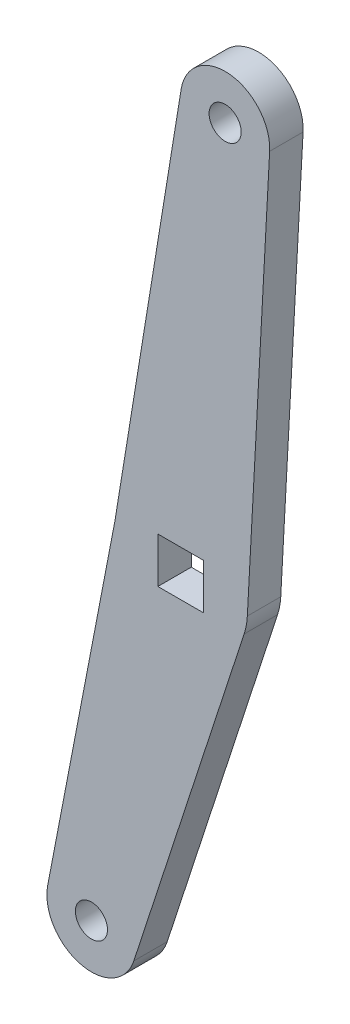
ISO-10303-21;
HEADER;
FILE_DESCRIPTION(('STEP AP214'),'2;1');
FILE_NAME('part.step','',(''),(''),'','','');
FILE_SCHEMA(('AUTOMOTIVE_DESIGN { 1 0 10303 214 1 1 1 1 }'));
ENDSEC;
DATA;
#1=APPLICATION_CONTEXT('core data for automotive mechanical design processes');
#2=APPLICATION_PROTOCOL_DEFINITION('international standard','automotive_design',2000,#1);
#3=PRODUCT_CONTEXT('',#1,'mechanical');
#4=PRODUCT('Part','Part','',(#3));
#5=PRODUCT_RELATED_PRODUCT_CATEGORY('part','',(#4));
#6=PRODUCT_DEFINITION_FORMATION('','',#4);
#7=PRODUCT_DEFINITION_CONTEXT('part definition',#1,'design');
#8=PRODUCT_DEFINITION('design','',#6,#7);
#9=PRODUCT_DEFINITION_SHAPE('','',#8);
#10=(LENGTH_UNIT() NAMED_UNIT(*) SI_UNIT(.MILLI.,.METRE.));
#11=(NAMED_UNIT(*) PLANE_ANGLE_UNIT() SI_UNIT($,.RADIAN.));
#12=(NAMED_UNIT(*) SI_UNIT($,.STERADIAN.) SOLID_ANGLE_UNIT());
#13=UNCERTAINTY_MEASURE_WITH_UNIT(LENGTH_MEASURE(1.E-05),#10,'distance_accuracy_value','');
#14=(GEOMETRIC_REPRESENTATION_CONTEXT(3) GLOBAL_UNCERTAINTY_ASSIGNED_CONTEXT((#13)) GLOBAL_UNIT_ASSIGNED_CONTEXT((#10,
#11,#12)) REPRESENTATION_CONTEXT('',''));
#15=CARTESIAN_POINT('',(0.,0.,0.));
#16=DIRECTION('',(0.,0.,1.));
#17=DIRECTION('',(1.,0.,0.));
#18=AXIS2_PLACEMENT_3D('',#15,#16,#17);
#19=CARTESIAN_POINT('',(0.,0.,4.7625));
#20=DIRECTION('',(0.,0.,1.));
#21=DIRECTION('',(1.,0.,0.));
#22=AXIS2_PLACEMENT_3D('',#19,#20,#21);
#23=PLANE('',#22);
#24=CARTESIAN_POINT('',(0.,0.,4.7625));
#25=DIRECTION('',(0.,0.,1.));
#26=DIRECTION('',(1.,0.,0.));
#27=AXIS2_PLACEMENT_3D('',#24,#25,#26);
#28=CIRCLE('',#27,2.286);
#29=CARTESIAN_POINT('',(-2.286,0.,4.7625));
#30=VERTEX_POINT('',#29);
#31=EDGE_CURVE('E208',#30,#30,#28,.T.);
#32=ORIENTED_EDGE('',*,*,#31,.F.);
#33=EDGE_LOOP('',(#32));
#34=FACE_BOUND('',#33,.T.);
#35=CARTESIAN_POINT('',(0.,0.,4.7625));
#36=DIRECTION('',(0.,0.,1.));
#37=DIRECTION('',(1.,0.,0.));
#38=AXIS2_PLACEMENT_3D('',#35,#36,#37);
#39=CIRCLE('',#38,6.35);
#40=CARTESIAN_POINT('',(-6.23554390119722,1.2002050892419,4.7625));
#41=VERTEX_POINT('',#40);
#42=CARTESIAN_POINT('',(6.03712204437629,-1.96866894659967,4.7625));
#43=VERTEX_POINT('',#42);
#44=EDGE_CURVE('E216',#41,#43,#39,.T.);
#45=ORIENTED_EDGE('',*,*,#44,.T.);
#46=DIRECTION('',(0.310026605763728,0.95072788100414,0.));
#47=VECTOR('',#46,1.);
#48=CARTESIAN_POINT('',(6.03712204437629,-1.96866894659967,4.7625));
#49=LINE('',#48,#47);
#50=CARTESIAN_POINT('',(21.7556830665642,46.2338850769344,4.7625));
#51=VERTEX_POINT('',#50);
#52=EDGE_CURVE('E220',#43,#51,#49,.T.);
#53=ORIENTED_EDGE('',*,*,#52,.T.);
#54=CARTESIAN_POINT('',(12.6999999999998,49.1868884968339,4.7625));
#55=DIRECTION('',(0.,0.,1.));
#56=DIRECTION('',(1.,0.,0.));
#57=AXIS2_PLACEMENT_3D('',#54,#55,#56);
#58=CIRCLE('',#57,9.525);
#59=CARTESIAN_POINT('',(22.2111674616562,48.6737427901112,4.7625));
#60=VERTEX_POINT('',#59);
#61=EDGE_CURVE('E224',#51,#60,#58,.T.);
#62=ORIENTED_EDGE('',*,*,#61,.T.);
#63=DIRECTION('',(0.0538735650102594,0.9985477650033,0.));
#64=VECTOR('',#63,1.);
#65=CARTESIAN_POINT('',(22.2111674616562,48.6737427901112,4.7625));
#66=LINE('',#65,#64);
#67=CARTESIAN_POINT('',(25.3907783077707,107.607902862185,4.7625));
#68=VERTEX_POINT('',#67);
#69=EDGE_CURVE('E227',#60,#68,#66,.T.);
#70=ORIENTED_EDGE('',*,*,#69,.T.);
#71=CARTESIAN_POINT('',(19.0499999999997,107.95,4.7625));
#72=DIRECTION('',(0.,0.,1.));
#73=DIRECTION('',(1.,0.,0.));
#74=AXIS2_PLACEMENT_3D('',#71,#72,#73);
#75=CIRCLE('',#74,6.35);
#76=CARTESIAN_POINT('',(12.782434592062,108.96986462691,4.7625));
#77=VERTEX_POINT('',#76);
#78=EDGE_CURVE('E230',#68,#77,#75,.T.);
#79=ORIENTED_EDGE('',*,*,#78,.T.);
#80=DIRECTION('',(-0.160608602663017,-0.98701817447838,0.));
#81=VECTOR('',#80,1.);
#82=CARTESIAN_POINT('',(3.36257567438122,51.0802385507713,4.7625));
#83=LINE('',#82,#81);
#84=CARTESIAN_POINT('',(3.36257567438122,51.0802385507713,4.7625));
#85=VERTEX_POINT('',#84);
#86=EDGE_CURVE('E233',#77,#85,#83,.T.);
#87=ORIENTED_EDGE('',*,*,#86,.T.);
#88=CARTESIAN_POINT('',(-2.90498973355649,52.1001031776814,4.7625));
#89=DIRECTION('',(0.,0.,-1.));
#90=DIRECTION('',(1.,0.,0.));
#91=AXIS2_PLACEMENT_3D('',#88,#89,#90);
#92=CIRCLE('',#91,6.35);
#93=CARTESIAN_POINT('',(3.33055416764073,50.8998980884395,4.7625));
#94=VERTEX_POINT('',#93);
#95=EDGE_CURVE('E236',#85,#94,#92,.T.);
#96=ORIENTED_EDGE('',*,*,#95,.T.);
#97=DIRECTION('',(-0.189008675471165,-0.981975417511373,0.));
#98=VECTOR('',#97,1.);
#99=CARTESIAN_POINT('',(-6.23554390119722,1.2002050892419,4.7625));
#100=LINE('',#99,#98);
#101=EDGE_CURVE('E239',#94,#41,#100,.T.);
#102=ORIENTED_EDGE('',*,*,#101,.T.);
#103=EDGE_LOOP('',(#45,#53,#62,#70,#79,#87,#96,#102));
#104=FACE_BOUND('',#103,.T.);
#105=CARTESIAN_POINT('',(19.0499999999997,107.95,4.7625));
#106=DIRECTION('',(0.,0.,1.));
#107=DIRECTION('',(1.,0.,0.));
#108=AXIS2_PLACEMENT_3D('',#105,#106,#107);
#109=CIRCLE('',#108,2.286);
#110=CARTESIAN_POINT('',(16.7639999999997,107.95,4.7625));
#111=VERTEX_POINT('',#110);
#112=EDGE_CURVE('E202',#111,#111,#109,.T.);
#113=ORIENTED_EDGE('',*,*,#112,.F.);
#114=EDGE_LOOP('',(#113));
#115=FACE_BOUND('',#114,.T.);
#116=DIRECTION('',(-1.,0.,0.));
#117=VECTOR('',#116,1.);
#118=CARTESIAN_POINT('',(9.46149999999975,52.4253884968339,4.7625));
#119=LINE('',#118,#117);
#120=CARTESIAN_POINT('',(15.9384999999998,52.4253884968339,4.7625));
#121=VERTEX_POINT('',#120);
#122=CARTESIAN_POINT('',(9.46149999999975,52.4253884968339,4.7625));
#123=VERTEX_POINT('',#122);
#124=EDGE_CURVE('E163',#121,#123,#119,.T.);
#125=ORIENTED_EDGE('',*,*,#124,.F.);
#126=DIRECTION('',(0.,1.,0.));
#127=VECTOR('',#126,1.);
#128=CARTESIAN_POINT('',(15.9384999999998,45.9483884968339,4.7625));
#129=LINE('',#128,#127);
#130=CARTESIAN_POINT('',(15.9384999999998,45.9483884968339,4.7625));
#131=VERTEX_POINT('',#130);
#132=EDGE_CURVE('E154',#131,#121,#129,.T.);
#133=ORIENTED_EDGE('',*,*,#132,.F.);
#134=DIRECTION('',(1.,0.,0.));
#135=VECTOR('',#134,1.);
#136=CARTESIAN_POINT('',(9.46149999999975,45.9483884968339,4.7625));
#137=LINE('',#136,#135);
#138=CARTESIAN_POINT('',(9.46149999999975,45.9483884968339,4.7625));
#139=VERTEX_POINT('',#138);
#140=EDGE_CURVE('E180',#139,#131,#137,.T.);
#141=ORIENTED_EDGE('',*,*,#140,.F.);
#142=DIRECTION('',(0.,-1.,0.));
#143=VECTOR('',#142,1.);
#144=CARTESIAN_POINT('',(9.46149999999975,45.9483884968339,4.7625));
#145=LINE('',#144,#143);
#146=EDGE_CURVE('E176',#123,#139,#145,.T.);
#147=ORIENTED_EDGE('',*,*,#146,.F.);
#148=EDGE_LOOP('',(#125,#133,#141,#147));
#149=FACE_BOUND('',#148,.T.);
#150=ADVANCED_FACE('F45',(#34,#104,#115,#149),#23,.T.);
#151=CARTESIAN_POINT('',(0.,0.,0.));
#152=DIRECTION('',(0.,0.,1.));
#153=DIRECTION('',(1.,0.,0.));
#154=AXIS2_PLACEMENT_3D('',#151,#152,#153);
#155=PLANE('',#154);
#156=CARTESIAN_POINT('',(19.0499999999997,107.95,0.));
#157=DIRECTION('',(0.,0.,1.));
#158=DIRECTION('',(1.,0.,0.));
#159=AXIS2_PLACEMENT_3D('',#156,#157,#158);
#160=CIRCLE('',#159,2.286);
#161=CARTESIAN_POINT('',(16.7639999999997,107.95,0.));
#162=VERTEX_POINT('',#161);
#163=EDGE_CURVE('E172',#162,#162,#160,.T.);
#164=ORIENTED_EDGE('',*,*,#163,.T.);
#165=EDGE_LOOP('',(#164));
#166=FACE_BOUND('',#165,.T.);
#167=CARTESIAN_POINT('',(0.,0.,0.));
#168=DIRECTION('',(0.,0.,1.));
#169=DIRECTION('',(1.,0.,0.));
#170=AXIS2_PLACEMENT_3D('',#167,#168,#169);
#171=CIRCLE('',#170,2.286);
#172=CARTESIAN_POINT('',(-2.286,0.,0.));
#173=VERTEX_POINT('',#172);
#174=EDGE_CURVE('E205',#173,#173,#171,.T.);
#175=ORIENTED_EDGE('',*,*,#174,.T.);
#176=EDGE_LOOP('',(#175));
#177=FACE_BOUND('',#176,.T.);
#178=CARTESIAN_POINT('',(0.,0.,0.));
#179=DIRECTION('',(0.,0.,1.));
#180=DIRECTION('',(1.,0.,0.));
#181=AXIS2_PLACEMENT_3D('',#178,#179,#180);
#182=CIRCLE('',#181,6.35);
#183=CARTESIAN_POINT('',(-6.23554390119722,1.2002050892419,0.));
#184=VERTEX_POINT('',#183);
#185=CARTESIAN_POINT('',(6.03712204437629,-1.96866894659967,0.));
#186=VERTEX_POINT('',#185);
#187=EDGE_CURVE('E212',#184,#186,#182,.T.);
#188=ORIENTED_EDGE('',*,*,#187,.F.);
#189=DIRECTION('',(-0.189008675471165,-0.981975417511373,0.));
#190=VECTOR('',#189,1.);
#191=CARTESIAN_POINT('',(-6.23554390119722,1.2002050892419,0.));
#192=LINE('',#191,#190);
#193=CARTESIAN_POINT('',(3.33055416764073,50.8998980884395,0.));
#194=VERTEX_POINT('',#193);
#195=EDGE_CURVE('E221',#194,#184,#192,.T.);
#196=ORIENTED_EDGE('',*,*,#195,.F.);
#197=CARTESIAN_POINT('',(-2.90498973355649,52.1001031776814,0.));
#198=DIRECTION('',(0.,0.,-1.));
#199=DIRECTION('',(1.,0.,0.));
#200=AXIS2_PLACEMENT_3D('',#197,#198,#199);
#201=CIRCLE('',#200,6.35);
#202=CARTESIAN_POINT('',(3.36257567438122,51.0802385507713,0.));
#203=VERTEX_POINT('',#202);
#204=EDGE_CURVE('E261',#203,#194,#201,.T.);
#205=ORIENTED_EDGE('',*,*,#204,.F.);
#206=DIRECTION('',(-0.160608602663017,-0.98701817447838,0.));
#207=VECTOR('',#206,1.);
#208=CARTESIAN_POINT('',(3.36257567438122,51.0802385507713,0.));
#209=LINE('',#208,#207);
#210=CARTESIAN_POINT('',(12.782434592062,108.96986462691,0.));
#211=VERTEX_POINT('',#210);
#212=EDGE_CURVE('E258',#211,#203,#209,.T.);
#213=ORIENTED_EDGE('',*,*,#212,.F.);
#214=CARTESIAN_POINT('',(19.0499999999997,107.95,0.));
#215=DIRECTION('',(0.,0.,1.));
#216=DIRECTION('',(1.,0.,0.));
#217=AXIS2_PLACEMENT_3D('',#214,#215,#216);
#218=CIRCLE('',#217,6.35);
#219=CARTESIAN_POINT('',(25.3907783077707,107.607902862185,0.));
#220=VERTEX_POINT('',#219);
#221=EDGE_CURVE('E255',#220,#211,#218,.T.);
#222=ORIENTED_EDGE('',*,*,#221,.F.);
#223=DIRECTION('',(0.0538735650102594,0.9985477650033,0.));
#224=VECTOR('',#223,1.);
#225=CARTESIAN_POINT('',(22.2111674616562,48.6737427901112,0.));
#226=LINE('',#225,#224);
#227=CARTESIAN_POINT('',(22.2111674616562,48.6737427901112,0.));
#228=VERTEX_POINT('',#227);
#229=EDGE_CURVE('E252',#228,#220,#226,.T.);
#230=ORIENTED_EDGE('',*,*,#229,.F.);
#231=CARTESIAN_POINT('',(12.6999999999998,49.1868884968339,0.));
#232=DIRECTION('',(0.,0.,1.));
#233=DIRECTION('',(1.,0.,0.));
#234=AXIS2_PLACEMENT_3D('',#231,#232,#233);
#235=CIRCLE('',#234,9.525);
#236=CARTESIAN_POINT('',(21.7556830665642,46.2338850769344,0.));
#237=VERTEX_POINT('',#236);
#238=EDGE_CURVE('E249',#237,#228,#235,.T.);
#239=ORIENTED_EDGE('',*,*,#238,.F.);
#240=DIRECTION('',(0.310026605763728,0.95072788100414,0.));
#241=VECTOR('',#240,1.);
#242=CARTESIAN_POINT('',(6.03712204437629,-1.96866894659967,0.));
#243=LINE('',#242,#241);
#244=EDGE_CURVE('E246',#186,#237,#243,.T.);
#245=ORIENTED_EDGE('',*,*,#244,.F.);
#246=EDGE_LOOP('',(#188,#196,#205,#213,#222,#230,#239,#245));
#247=FACE_BOUND('',#246,.T.);
#248=DIRECTION('',(0.,1.,0.));
#249=VECTOR('',#248,1.);
#250=CARTESIAN_POINT('',(15.9384999999998,45.9483884968339,0.));
#251=LINE('',#250,#249);
#252=CARTESIAN_POINT('',(15.9384999999998,45.9483884968339,0.));
#253=VERTEX_POINT('',#252);
#254=CARTESIAN_POINT('',(15.9384999999998,52.4253884968339,0.));
#255=VERTEX_POINT('',#254);
#256=EDGE_CURVE('E74',#253,#255,#251,.T.);
#257=ORIENTED_EDGE('',*,*,#256,.T.);
#258=DIRECTION('',(-1.,0.,0.));
#259=VECTOR('',#258,1.);
#260=CARTESIAN_POINT('',(9.46149999999975,52.4253884968339,0.));
#261=LINE('',#260,#259);
#262=CARTESIAN_POINT('',(9.46149999999975,52.4253884968339,0.));
#263=VERTEX_POINT('',#262);
#264=EDGE_CURVE('E170',#255,#263,#261,.T.);
#265=ORIENTED_EDGE('',*,*,#264,.T.);
#266=DIRECTION('',(0.,-1.,0.));
#267=VECTOR('',#266,1.);
#268=CARTESIAN_POINT('',(9.46149999999975,45.9483884968339,0.));
#269=LINE('',#268,#267);
#270=CARTESIAN_POINT('',(9.46149999999975,45.9483884968339,0.));
#271=VERTEX_POINT('',#270);
#272=EDGE_CURVE('E189',#263,#271,#269,.T.);
#273=ORIENTED_EDGE('',*,*,#272,.T.);
#274=DIRECTION('',(1.,0.,0.));
#275=VECTOR('',#274,1.);
#276=CARTESIAN_POINT('',(9.46149999999975,45.9483884968339,0.));
#277=LINE('',#276,#275);
#278=EDGE_CURVE('E164',#271,#253,#277,.T.);
#279=ORIENTED_EDGE('',*,*,#278,.T.);
#280=EDGE_LOOP('',(#257,#265,#273,#279));
#281=FACE_BOUND('',#280,.T.);
#282=ADVANCED_FACE('F299',(#166,#177,#247,#281),#155,.F.);
#283=CARTESIAN_POINT('',(0.,0.,4.7625));
#284=DIRECTION('',(0.,0.,-1.));
#285=DIRECTION('',(-1.,0.,0.));
#286=AXIS2_PLACEMENT_3D('',#283,#284,#285);
#287=CYLINDRICAL_SURFACE('',#286,6.35);
#288=ORIENTED_EDGE('',*,*,#187,.T.);
#289=DIRECTION('',(0.,0.,-1.));
#290=VECTOR('',#289,1.);
#291=CARTESIAN_POINT('',(6.03712204437629,-1.96866894659967,4.7625));
#292=LINE('',#291,#290);
#293=EDGE_CURVE('E11',#43,#186,#292,.T.);
#294=ORIENTED_EDGE('',*,*,#293,.F.);
#295=ORIENTED_EDGE('',*,*,#44,.F.);
#296=DIRECTION('',(0.,0.,-1.));
#297=VECTOR('',#296,1.);
#298=CARTESIAN_POINT('',(-6.23554390119722,1.2002050892419,4.7625));
#299=LINE('',#298,#297);
#300=EDGE_CURVE('E242',#41,#184,#299,.T.);
#301=ORIENTED_EDGE('',*,*,#300,.T.);
#302=EDGE_LOOP('',(#288,#294,#295,#301));
#303=FACE_BOUND('',#302,.T.);
#304=ADVANCED_FACE('F47',(#303),#287,.T.);
#305=CARTESIAN_POINT('',(6.03712204437629,-1.96866894659967,4.7625));
#306=DIRECTION('',(-0.95072788100414,0.310026605763728,0.));
#307=DIRECTION('',(-0.310026605763728,-0.95072788100414,0.));
#308=AXIS2_PLACEMENT_3D('',#305,#306,#307);
#309=PLANE('',#308);
#310=ORIENTED_EDGE('',*,*,#244,.T.);
#311=DIRECTION('',(0.,0.,-1.));
#312=VECTOR('',#311,1.);
#313=CARTESIAN_POINT('',(21.7556830665642,46.2338850769344,4.7625));
#314=LINE('',#313,#312);
#315=EDGE_CURVE('E53',#51,#237,#314,.T.);
#316=ORIENTED_EDGE('',*,*,#315,.F.);
#317=ORIENTED_EDGE('',*,*,#52,.F.);
#318=ORIENTED_EDGE('',*,*,#293,.T.);
#319=EDGE_LOOP('',(#310,#316,#317,#318));
#320=FACE_BOUND('',#319,.T.);
#321=ADVANCED_FACE('F317',(#320),#309,.F.);
#322=CARTESIAN_POINT('',(12.6999999999998,49.1868884968339,4.7625));
#323=DIRECTION('',(0.,0.,-1.));
#324=DIRECTION('',(-1.,0.,0.));
#325=AXIS2_PLACEMENT_3D('',#322,#323,#324);
#326=CYLINDRICAL_SURFACE('',#325,9.525);
#327=ORIENTED_EDGE('',*,*,#238,.T.);
#328=DIRECTION('',(0.,0.,-1.));
#329=VECTOR('',#328,1.);
#330=CARTESIAN_POINT('',(22.2111674616562,48.6737427901112,4.7625));
#331=LINE('',#330,#329);
#332=EDGE_CURVE('E284',#60,#228,#331,.T.);
#333=ORIENTED_EDGE('',*,*,#332,.F.);
#334=ORIENTED_EDGE('',*,*,#61,.F.);
#335=ORIENTED_EDGE('',*,*,#315,.T.);
#336=EDGE_LOOP('',(#327,#333,#334,#335));
#337=FACE_BOUND('',#336,.T.);
#338=ADVANCED_FACE('F293',(#337),#326,.T.);
#339=CARTESIAN_POINT('',(22.2111674616562,48.6737427901112,4.7625));
#340=DIRECTION('',(-0.9985477650033,0.0538735650102594,0.));
#341=DIRECTION('',(-0.0538735650102594,-0.9985477650033,0.));
#342=AXIS2_PLACEMENT_3D('',#339,#340,#341);
#343=PLANE('',#342);
#344=ORIENTED_EDGE('',*,*,#229,.T.);
#345=DIRECTION('',(0.,0.,-1.));
#346=VECTOR('',#345,1.);
#347=CARTESIAN_POINT('',(25.3907783077707,107.607902862185,4.7625));
#348=LINE('',#347,#346);
#349=EDGE_CURVE('E281',#68,#220,#348,.T.);
#350=ORIENTED_EDGE('',*,*,#349,.F.);
#351=ORIENTED_EDGE('',*,*,#69,.F.);
#352=ORIENTED_EDGE('',*,*,#332,.T.);
#353=EDGE_LOOP('',(#344,#350,#351,#352));
#354=FACE_BOUND('',#353,.T.);
#355=ADVANCED_FACE('F305',(#354),#343,.F.);
#356=CARTESIAN_POINT('',(19.0499999999997,107.95,4.7625));
#357=DIRECTION('',(0.,0.,-1.));
#358=DIRECTION('',(-1.,0.,0.));
#359=AXIS2_PLACEMENT_3D('',#356,#357,#358);
#360=CYLINDRICAL_SURFACE('',#359,6.35);
#361=ORIENTED_EDGE('',*,*,#221,.T.);
#362=DIRECTION('',(0.,0.,-1.));
#363=VECTOR('',#362,1.);
#364=CARTESIAN_POINT('',(12.782434592062,108.96986462691,4.7625));
#365=LINE('',#364,#363);
#366=EDGE_CURVE('E277',#77,#211,#365,.T.);
#367=ORIENTED_EDGE('',*,*,#366,.F.);
#368=ORIENTED_EDGE('',*,*,#78,.F.);
#369=ORIENTED_EDGE('',*,*,#349,.T.);
#370=EDGE_LOOP('',(#361,#367,#368,#369));
#371=FACE_BOUND('',#370,.T.);
#372=ADVANCED_FACE('F309',(#371),#360,.T.);
#373=CARTESIAN_POINT('',(3.36257567438122,51.0802385507713,4.7625));
#374=DIRECTION('',(0.98701817447838,-0.160608602663017,0.));
#375=DIRECTION('',(0.160608602663017,0.98701817447838,0.));
#376=AXIS2_PLACEMENT_3D('',#373,#374,#375);
#377=PLANE('',#376);
#378=ORIENTED_EDGE('',*,*,#212,.T.);
#379=DIRECTION('',(0.,0.,-1.));
#380=VECTOR('',#379,1.);
#381=CARTESIAN_POINT('',(3.36257567438122,51.0802385507713,4.7625));
#382=LINE('',#381,#380);
#383=EDGE_CURVE('E273',#85,#203,#382,.T.);
#384=ORIENTED_EDGE('',*,*,#383,.F.);
#385=ORIENTED_EDGE('',*,*,#86,.F.);
#386=ORIENTED_EDGE('',*,*,#366,.T.);
#387=EDGE_LOOP('',(#378,#384,#385,#386));
#388=FACE_BOUND('',#387,.T.);
#389=ADVANCED_FACE('F330',(#388),#377,.F.);
#390=CARTESIAN_POINT('',(-2.90498973355649,52.1001031776814,4.7625));
#391=DIRECTION('',(0.,0.,-1.));
#392=DIRECTION('',(-1.,0.,0.));
#393=AXIS2_PLACEMENT_3D('',#390,#391,#392);
#394=CYLINDRICAL_SURFACE('',#393,6.35);
#395=ORIENTED_EDGE('',*,*,#204,.T.);
#396=DIRECTION('',(0.,0.,-1.));
#397=VECTOR('',#396,1.);
#398=CARTESIAN_POINT('',(3.33055416764073,50.8998980884395,4.7625));
#399=LINE('',#398,#397);
#400=EDGE_CURVE('E269',#94,#194,#399,.T.);
#401=ORIENTED_EDGE('',*,*,#400,.F.);
#402=ORIENTED_EDGE('',*,*,#95,.F.);
#403=ORIENTED_EDGE('',*,*,#383,.T.);
#404=EDGE_LOOP('',(#395,#401,#402,#403));
#405=FACE_BOUND('',#404,.T.);
#406=ADVANCED_FACE('F328',(#405),#394,.F.);
#407=CARTESIAN_POINT('',(-6.23554390119722,1.2002050892419,4.7625));
#408=DIRECTION('',(0.981975417511373,-0.189008675471165,0.));
#409=DIRECTION('',(0.189008675471165,0.981975417511373,0.));
#410=AXIS2_PLACEMENT_3D('',#407,#408,#409);
#411=PLANE('',#410);
#412=ORIENTED_EDGE('',*,*,#195,.T.);
#413=ORIENTED_EDGE('',*,*,#300,.F.);
#414=ORIENTED_EDGE('',*,*,#101,.F.);
#415=ORIENTED_EDGE('',*,*,#400,.T.);
#416=EDGE_LOOP('',(#412,#413,#414,#415));
#417=FACE_BOUND('',#416,.T.);
#418=ADVANCED_FACE('F323',(#417),#411,.F.);
#419=CARTESIAN_POINT('',(0.,0.,4.7625));
#420=DIRECTION('',(0.,0.,-1.));
#421=DIRECTION('',(-1.,0.,0.));
#422=AXIS2_PLACEMENT_3D('',#419,#420,#421);
#423=CYLINDRICAL_SURFACE('',#422,2.286);
#424=CARTESIAN_POINT('',(-2.286,0.,4.7625));
#425=CARTESIAN_POINT('',(-2.286,0.,4.712890625));
#426=CARTESIAN_POINT('',(-2.286,0.,4.66328125));
#427=CARTESIAN_POINT('',(-2.286,0.,4.5640625));
#428=CARTESIAN_POINT('',(-2.286,0.,4.514453125));
#429=CARTESIAN_POINT('',(-2.286,0.,4.415234375));
#430=CARTESIAN_POINT('',(-2.286,0.,4.365625));
#431=CARTESIAN_POINT('',(-2.286,0.,4.26640625));
#432=CARTESIAN_POINT('',(-2.286,0.,4.216796875));
#433=CARTESIAN_POINT('',(-2.286,0.,4.117578125));
#434=CARTESIAN_POINT('',(-2.286,0.,4.06796875));
#435=CARTESIAN_POINT('',(-2.286,0.,3.96875));
#436=CARTESIAN_POINT('',(-2.286,0.,3.919140625));
#437=CARTESIAN_POINT('',(-2.286,0.,3.819921875));
#438=CARTESIAN_POINT('',(-2.286,0.,3.7703125));
#439=CARTESIAN_POINT('',(-2.286,0.,3.67109375));
#440=CARTESIAN_POINT('',(-2.286,0.,3.621484375));
#441=CARTESIAN_POINT('',(-2.286,0.,3.522265625));
#442=CARTESIAN_POINT('',(-2.286,0.,3.47265625));
#443=CARTESIAN_POINT('',(-2.286,0.,3.3734375));
#444=CARTESIAN_POINT('',(-2.286,0.,3.323828125));
#445=CARTESIAN_POINT('',(-2.286,0.,3.224609375));
#446=CARTESIAN_POINT('',(-2.286,0.,3.175));
#447=CARTESIAN_POINT('',(-2.286,0.,3.07578125));
#448=CARTESIAN_POINT('',(-2.286,0.,3.026171875));
#449=CARTESIAN_POINT('',(-2.286,0.,2.926953125));
#450=CARTESIAN_POINT('',(-2.286,0.,2.87734375));
#451=CARTESIAN_POINT('',(-2.286,0.,2.778125));
#452=CARTESIAN_POINT('',(-2.286,0.,2.728515625));
#453=CARTESIAN_POINT('',(-2.286,0.,2.629296875));
#454=CARTESIAN_POINT('',(-2.286,0.,2.5796875));
#455=CARTESIAN_POINT('',(-2.286,0.,2.48046875));
#456=CARTESIAN_POINT('',(-2.286,0.,2.430859375));
#457=CARTESIAN_POINT('',(-2.286,0.,2.331640625));
#458=CARTESIAN_POINT('',(-2.286,0.,2.28203125));
#459=CARTESIAN_POINT('',(-2.286,0.,2.1828125));
#460=CARTESIAN_POINT('',(-2.286,0.,2.133203125));
#461=CARTESIAN_POINT('',(-2.286,0.,2.033984375));
#462=CARTESIAN_POINT('',(-2.286,0.,1.984375));
#463=CARTESIAN_POINT('',(-2.286,0.,1.88515625));
#464=CARTESIAN_POINT('',(-2.286,0.,1.835546875));
#465=CARTESIAN_POINT('',(-2.286,0.,1.736328125));
#466=CARTESIAN_POINT('',(-2.286,0.,1.68671875));
#467=CARTESIAN_POINT('',(-2.286,0.,1.5875));
#468=CARTESIAN_POINT('',(-2.286,0.,1.537890625));
#469=CARTESIAN_POINT('',(-2.286,0.,1.438671875));
#470=CARTESIAN_POINT('',(-2.286,0.,1.3890625));
#471=CARTESIAN_POINT('',(-2.286,0.,1.28984375));
#472=CARTESIAN_POINT('',(-2.286,0.,1.240234375));
#473=CARTESIAN_POINT('',(-2.286,0.,1.141015625));
#474=CARTESIAN_POINT('',(-2.286,0.,1.09140625));
#475=CARTESIAN_POINT('',(-2.286,0.,0.992187499999999));
#476=CARTESIAN_POINT('',(-2.286,0.,0.942578124999999));
#477=CARTESIAN_POINT('',(-2.286,0.,0.843359375));
#478=CARTESIAN_POINT('',(-2.286,0.,0.79375));
#479=CARTESIAN_POINT('',(-2.286,0.,0.69453125));
#480=CARTESIAN_POINT('',(-2.286,0.,0.644921875));
#481=CARTESIAN_POINT('',(-2.286,0.,0.545703125));
#482=CARTESIAN_POINT('',(-2.286,0.,0.49609375));
#483=CARTESIAN_POINT('',(-2.286,0.,0.396875));
#484=CARTESIAN_POINT('',(-2.286,0.,0.347265625));
#485=CARTESIAN_POINT('',(-2.286,0.,0.248046875));
#486=CARTESIAN_POINT('',(-2.286,0.,0.1984375));
#487=CARTESIAN_POINT('',(-2.286,0.,0.09921875));
#488=CARTESIAN_POINT('',(-2.286,0.,0.049609375));
#489=CARTESIAN_POINT('',(-2.286,0.,0.));
#490=B_SPLINE_CURVE_WITH_KNOTS('',3,(#424,#425,#426,#427,#428,#429,#430,#431,#432,#433,#434,
#435,#436,#437,#438,#439,#440,#441,#442,#443,#444,#445,#446,#447,#448,#449,#450,#451,#452,#453,
#454,#455,#456,#457,#458,#459,#460,#461,#462,#463,#464,#465,#466,#467,#468,#469,#470,#471,#472,
#473,#474,#475,#476,#477,#478,#479,#480,#481,#482,#483,#484,#485,#486,#487,#488,#489),
.UNSPECIFIED.,.F.,.F.,(4,2,2,2,2,2,2,2,2,2,2,2,2,2,2,2,2,2,2,2,2,2,2,2,2,2,2,2,2,2,2,2,4),(0.,
0.148828125,0.29765625,0.446484375,0.5953125,0.744140625,0.892968750000001,1.041796875,1.190625,
1.339453125,1.48828125,1.637109375,1.7859375,1.934765625,2.08359375,2.232421875,2.38125,
2.530078125,2.67890625,2.827734375,2.9765625,3.125390625,3.27421875,3.423046875,3.571875,
3.720703125,3.86953125,4.018359375,4.1671875,4.316015625,4.46484375,4.613671875,4.7625),.UNSPECIFIED.);
#491=EDGE_CURVE('BSEAM348',#30,#173,#490,.T.);
#492=ORIENTED_EDGE('',*,*,#31,.T.);
#493=ORIENTED_EDGE('',*,*,#174,.F.);
#494=ORIENTED_EDGE('',*,*,#491,.T.);
#495=ORIENTED_EDGE('',*,*,#491,.F.);
#496=EDGE_LOOP('',(#492,#494,#493,#495));
#497=FACE_BOUND('',#496,.T.);
#498=ADVANCED_FACE('F348',(#497),#423,.F.);
#499=CARTESIAN_POINT('',(19.0499999999997,107.95,4.7625));
#500=DIRECTION('',(0.,0.,-1.));
#501=DIRECTION('',(-1.,0.,0.));
#502=AXIS2_PLACEMENT_3D('',#499,#500,#501);
#503=CYLINDRICAL_SURFACE('',#502,2.286);
#504=CARTESIAN_POINT('',(16.7639999999997,107.95,4.7625));
#505=CARTESIAN_POINT('',(16.7639999999997,107.95,4.712890625));
#506=CARTESIAN_POINT('',(16.7639999999997,107.95,4.66328125));
#507=CARTESIAN_POINT('',(16.7639999999997,107.95,4.5640625));
#508=CARTESIAN_POINT('',(16.7639999999997,107.95,4.514453125));
#509=CARTESIAN_POINT('',(16.7639999999997,107.95,4.415234375));
#510=CARTESIAN_POINT('',(16.7639999999997,107.95,4.365625));
#511=CARTESIAN_POINT('',(16.7639999999997,107.95,4.26640625));
#512=CARTESIAN_POINT('',(16.7639999999997,107.95,4.216796875));
#513=CARTESIAN_POINT('',(16.7639999999997,107.95,4.117578125));
#514=CARTESIAN_POINT('',(16.7639999999997,107.95,4.06796875));
#515=CARTESIAN_POINT('',(16.7639999999997,107.95,3.96875));
#516=CARTESIAN_POINT('',(16.7639999999997,107.95,3.919140625));
#517=CARTESIAN_POINT('',(16.7639999999997,107.95,3.819921875));
#518=CARTESIAN_POINT('',(16.7639999999997,107.95,3.7703125));
#519=CARTESIAN_POINT('',(16.7639999999997,107.95,3.67109375));
#520=CARTESIAN_POINT('',(16.7639999999997,107.95,3.621484375));
#521=CARTESIAN_POINT('',(16.7639999999997,107.95,3.522265625));
#522=CARTESIAN_POINT('',(16.7639999999997,107.95,3.47265625));
#523=CARTESIAN_POINT('',(16.7639999999997,107.95,3.3734375));
#524=CARTESIAN_POINT('',(16.7639999999997,107.95,3.323828125));
#525=CARTESIAN_POINT('',(16.7639999999997,107.95,3.224609375));
#526=CARTESIAN_POINT('',(16.7639999999997,107.95,3.175));
#527=CARTESIAN_POINT('',(16.7639999999997,107.95,3.07578125));
#528=CARTESIAN_POINT('',(16.7639999999997,107.95,3.026171875));
#529=CARTESIAN_POINT('',(16.7639999999997,107.95,2.926953125));
#530=CARTESIAN_POINT('',(16.7639999999997,107.95,2.87734375));
#531=CARTESIAN_POINT('',(16.7639999999997,107.95,2.778125));
#532=CARTESIAN_POINT('',(16.7639999999997,107.95,2.728515625));
#533=CARTESIAN_POINT('',(16.7639999999997,107.95,2.629296875));
#534=CARTESIAN_POINT('',(16.7639999999997,107.95,2.5796875));
#535=CARTESIAN_POINT('',(16.7639999999997,107.95,2.48046875));
#536=CARTESIAN_POINT('',(16.7639999999997,107.95,2.430859375));
#537=CARTESIAN_POINT('',(16.7639999999997,107.95,2.331640625));
#538=CARTESIAN_POINT('',(16.7639999999997,107.95,2.28203125));
#539=CARTESIAN_POINT('',(16.7639999999997,107.95,2.1828125));
#540=CARTESIAN_POINT('',(16.7639999999997,107.95,2.133203125));
#541=CARTESIAN_POINT('',(16.7639999999997,107.95,2.033984375));
#542=CARTESIAN_POINT('',(16.7639999999997,107.95,1.984375));
#543=CARTESIAN_POINT('',(16.7639999999997,107.95,1.88515625));
#544=CARTESIAN_POINT('',(16.7639999999997,107.95,1.835546875));
#545=CARTESIAN_POINT('',(16.7639999999997,107.95,1.736328125));
#546=CARTESIAN_POINT('',(16.7639999999997,107.95,1.68671875));
#547=CARTESIAN_POINT('',(16.7639999999997,107.95,1.5875));
#548=CARTESIAN_POINT('',(16.7639999999997,107.95,1.537890625));
#549=CARTESIAN_POINT('',(16.7639999999997,107.95,1.438671875));
#550=CARTESIAN_POINT('',(16.7639999999997,107.95,1.3890625));
#551=CARTESIAN_POINT('',(16.7639999999997,107.95,1.28984375));
#552=CARTESIAN_POINT('',(16.7639999999997,107.95,1.240234375));
#553=CARTESIAN_POINT('',(16.7639999999997,107.95,1.141015625));
#554=CARTESIAN_POINT('',(16.7639999999997,107.95,1.09140625));
#555=CARTESIAN_POINT('',(16.7639999999997,107.95,0.992187499999999));
#556=CARTESIAN_POINT('',(16.7639999999997,107.95,0.942578124999999));
#557=CARTESIAN_POINT('',(16.7639999999997,107.95,0.843359375));
#558=CARTESIAN_POINT('',(16.7639999999997,107.95,0.79375));
#559=CARTESIAN_POINT('',(16.7639999999997,107.95,0.69453125));
#560=CARTESIAN_POINT('',(16.7639999999997,107.95,0.644921875));
#561=CARTESIAN_POINT('',(16.7639999999997,107.95,0.545703125));
#562=CARTESIAN_POINT('',(16.7639999999997,107.95,0.49609375));
#563=CARTESIAN_POINT('',(16.7639999999997,107.95,0.396875));
#564=CARTESIAN_POINT('',(16.7639999999997,107.95,0.347265625));
#565=CARTESIAN_POINT('',(16.7639999999997,107.95,0.248046875));
#566=CARTESIAN_POINT('',(16.7639999999997,107.95,0.1984375));
#567=CARTESIAN_POINT('',(16.7639999999997,107.95,0.09921875));
#568=CARTESIAN_POINT('',(16.7639999999997,107.95,0.049609375));
#569=CARTESIAN_POINT('',(16.7639999999997,107.95,0.));
#570=B_SPLINE_CURVE_WITH_KNOTS('',3,(#504,#505,#506,#507,#508,#509,#510,#511,#512,#513,#514,
#515,#516,#517,#518,#519,#520,#521,#522,#523,#524,#525,#526,#527,#528,#529,#530,#531,#532,#533,
#534,#535,#536,#537,#538,#539,#540,#541,#542,#543,#544,#545,#546,#547,#548,#549,#550,#551,#552,
#553,#554,#555,#556,#557,#558,#559,#560,#561,#562,#563,#564,#565,#566,#567,#568,#569),
.UNSPECIFIED.,.F.,.F.,(4,2,2,2,2,2,2,2,2,2,2,2,2,2,2,2,2,2,2,2,2,2,2,2,2,2,2,2,2,2,2,2,4),(0.,
0.148828125,0.29765625,0.446484375,0.5953125,0.744140625,0.892968750000001,1.041796875,1.190625,
1.339453125,1.48828125,1.637109375,1.7859375,1.934765625,2.08359375,2.232421875,2.38125,
2.530078125,2.67890625,2.827734375,2.9765625,3.125390625,3.27421875,3.423046875,3.571875,
3.720703125,3.86953125,4.018359375,4.1671875,4.316015625,4.46484375,4.613671875,4.7625),.UNSPECIFIED.);
#571=EDGE_CURVE('BSEAM355',#111,#162,#570,.T.);
#572=ORIENTED_EDGE('',*,*,#112,.T.);
#573=ORIENTED_EDGE('',*,*,#163,.F.);
#574=ORIENTED_EDGE('',*,*,#571,.T.);
#575=ORIENTED_EDGE('',*,*,#571,.F.);
#576=EDGE_LOOP('',(#572,#574,#573,#575));
#577=FACE_BOUND('',#576,.T.);
#578=ADVANCED_FACE('F355',(#577),#503,.F.);
#579=CARTESIAN_POINT('',(15.9384999999998,45.9483884968339,4.7625));
#580=DIRECTION('',(-1.,0.,0.));
#581=DIRECTION('',(0.,0.,1.));
#582=AXIS2_PLACEMENT_3D('',#579,#580,#581);
#583=PLANE('',#582);
#584=ORIENTED_EDGE('',*,*,#256,.F.);
#585=DIRECTION('',(0.,0.,-1.));
#586=VECTOR('',#585,1.);
#587=CARTESIAN_POINT('',(15.9384999999998,45.9483884968339,4.7625));
#588=LINE('',#587,#586);
#589=EDGE_CURVE('E158',#131,#253,#588,.T.);
#590=ORIENTED_EDGE('',*,*,#589,.F.);
#591=ORIENTED_EDGE('',*,*,#132,.T.);
#592=DIRECTION('',(0.,0.,-1.));
#593=VECTOR('',#592,1.);
#594=CARTESIAN_POINT('',(15.9384999999998,52.4253884968339,4.7625));
#595=LINE('',#594,#593);
#596=EDGE_CURVE('E157',#121,#255,#595,.T.);
#597=ORIENTED_EDGE('',*,*,#596,.T.);
#598=EDGE_LOOP('',(#584,#590,#591,#597));
#599=FACE_BOUND('',#598,.T.);
#600=ADVANCED_FACE('F156',(#599),#583,.T.);
#601=CARTESIAN_POINT('',(9.46149999999975,52.4253884968339,4.7625));
#602=DIRECTION('',(0.,-1.,0.));
#603=DIRECTION('',(0.,0.,-1.));
#604=AXIS2_PLACEMENT_3D('',#601,#602,#603);
#605=PLANE('',#604);
#606=ORIENTED_EDGE('',*,*,#264,.F.);
#607=ORIENTED_EDGE('',*,*,#596,.F.);
#608=ORIENTED_EDGE('',*,*,#124,.T.);
#609=DIRECTION('',(0.,0.,-1.));
#610=VECTOR('',#609,1.);
#611=CARTESIAN_POINT('',(9.46149999999975,52.4253884968339,4.7625));
#612=LINE('',#611,#610);
#613=EDGE_CURVE('E173',#123,#263,#612,.T.);
#614=ORIENTED_EDGE('',*,*,#613,.T.);
#615=EDGE_LOOP('',(#606,#607,#608,#614));
#616=FACE_BOUND('',#615,.T.);
#617=ADVANCED_FACE('F167',(#616),#605,.T.);
#618=CARTESIAN_POINT('',(9.46149999999975,45.9483884968339,4.7625));
#619=DIRECTION('',(1.,0.,0.));
#620=DIRECTION('',(0.,0.,-1.));
#621=AXIS2_PLACEMENT_3D('',#618,#619,#620);
#622=PLANE('',#621);
#623=ORIENTED_EDGE('',*,*,#272,.F.);
#624=ORIENTED_EDGE('',*,*,#613,.F.);
#625=ORIENTED_EDGE('',*,*,#146,.T.);
#626=DIRECTION('',(0.,0.,-1.));
#627=VECTOR('',#626,1.);
#628=CARTESIAN_POINT('',(9.46149999999975,45.9483884968339,4.7625));
#629=LINE('',#628,#627);
#630=EDGE_CURVE('E63',#139,#271,#629,.T.);
#631=ORIENTED_EDGE('',*,*,#630,.T.);
#632=EDGE_LOOP('',(#623,#624,#625,#631));
#633=FACE_BOUND('',#632,.T.);
#634=ADVANCED_FACE('F372',(#633),#622,.T.);
#635=CARTESIAN_POINT('',(9.46149999999975,45.9483884968339,4.7625));
#636=DIRECTION('',(0.,1.,0.));
#637=DIRECTION('',(0.,0.,1.));
#638=AXIS2_PLACEMENT_3D('',#635,#636,#637);
#639=PLANE('',#638);
#640=ORIENTED_EDGE('',*,*,#278,.F.);
#641=ORIENTED_EDGE('',*,*,#630,.F.);
#642=ORIENTED_EDGE('',*,*,#140,.T.);
#643=ORIENTED_EDGE('',*,*,#589,.T.);
#644=EDGE_LOOP('',(#640,#641,#642,#643));
#645=FACE_BOUND('',#644,.T.);
#646=ADVANCED_FACE('F375',(#645),#639,.T.);
#647=CLOSED_SHELL('',(#150,#282,#304,#321,#338,#355,#372,#389,#406,#418,#498,#578,#600,#617,
#634,#646));
#648=MANIFOLD_SOLID_BREP('B2',#647);
#649=ADVANCED_BREP_SHAPE_REPRESENTATION('',(#18,#648),#14);
#650=SHAPE_DEFINITION_REPRESENTATION(#9,#649);
ENDSEC;
END-ISO-10303-21;
